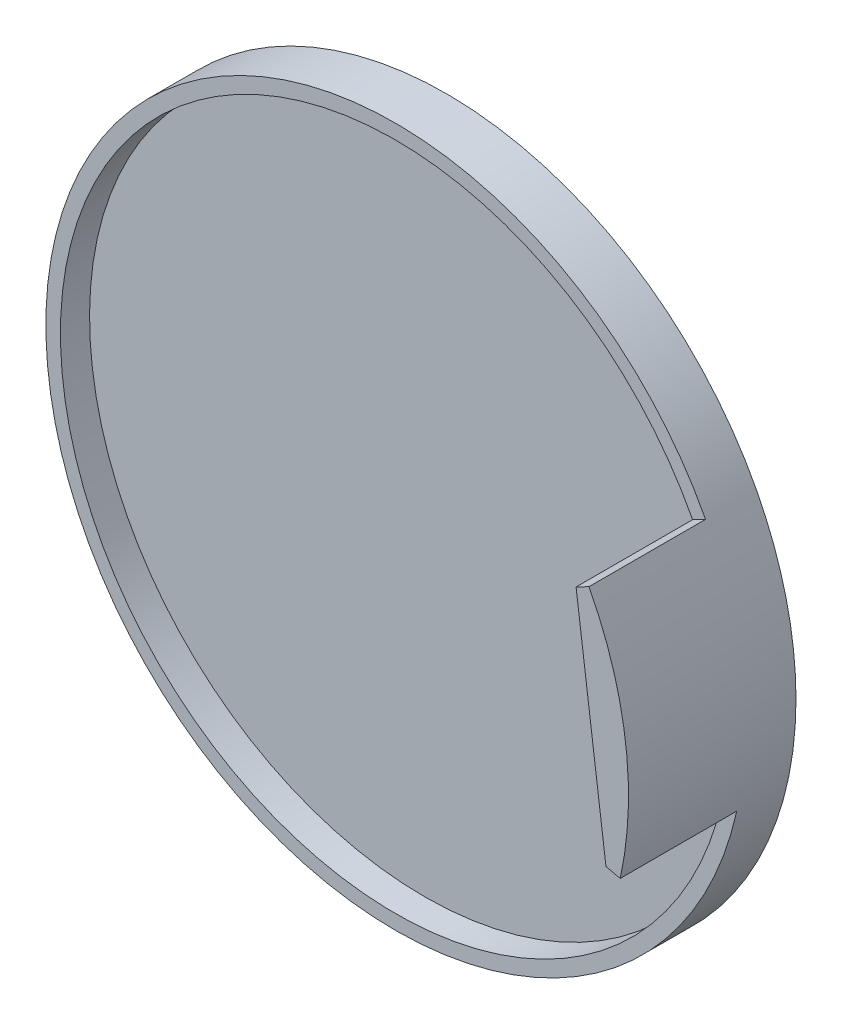
ISO-10303-21;
HEADER;
FILE_DESCRIPTION(('STEP AP214'),'2;1');
FILE_NAME('part.step','',(''),(''),'','','');
FILE_SCHEMA(('AUTOMOTIVE_DESIGN { 1 0 10303 214 1 1 1 1 }'));
ENDSEC;
DATA;
#1=APPLICATION_CONTEXT('core data for automotive mechanical design processes');
#2=APPLICATION_PROTOCOL_DEFINITION('international standard','automotive_design',2000,#1);
#3=PRODUCT_CONTEXT('',#1,'mechanical');
#4=PRODUCT('Part','Part','',(#3));
#5=PRODUCT_RELATED_PRODUCT_CATEGORY('part','',(#4));
#6=PRODUCT_DEFINITION_FORMATION('','',#4);
#7=PRODUCT_DEFINITION_CONTEXT('part definition',#1,'design');
#8=PRODUCT_DEFINITION('design','',#6,#7);
#9=PRODUCT_DEFINITION_SHAPE('','',#8);
#10=(LENGTH_UNIT() NAMED_UNIT(*) SI_UNIT(.MILLI.,.METRE.));
#11=(NAMED_UNIT(*) PLANE_ANGLE_UNIT() SI_UNIT($,.RADIAN.));
#12=(NAMED_UNIT(*) SI_UNIT($,.STERADIAN.) SOLID_ANGLE_UNIT());
#13=UNCERTAINTY_MEASURE_WITH_UNIT(LENGTH_MEASURE(1.E-05),#10,'distance_accuracy_value','');
#14=(GEOMETRIC_REPRESENTATION_CONTEXT(3) GLOBAL_UNCERTAINTY_ASSIGNED_CONTEXT((#13)) GLOBAL_UNIT_ASSIGNED_CONTEXT((#10,
#11,#12)) REPRESENTATION_CONTEXT('',''));
#15=CARTESIAN_POINT('',(0.,0.,0.));
#16=DIRECTION('',(0.,0.,1.));
#17=DIRECTION('',(1.,0.,0.));
#18=AXIS2_PLACEMENT_3D('',#15,#16,#17);
#19=CARTESIAN_POINT('',(0.,0.,7.));
#20=DIRECTION('',(0.,0.,-1.));
#21=DIRECTION('',(-1.,0.,0.));
#22=AXIS2_PLACEMENT_3D('',#19,#20,#21);
#23=CYLINDRICAL_SURFACE('',#22,46.);
#24=DIRECTION('',(0.,0.,-1.));
#25=VECTOR('',#24,1.);
#26=CARTESIAN_POINT('',(44.9094466857138,-9.95698741502827,23.));
#27=LINE('',#26,#25);
#28=CARTESIAN_POINT('',(44.9094466857138,-9.95698741502827,7.));
#29=VERTEX_POINT('',#28);
#30=CARTESIAN_POINT('',(44.9094466857138,-9.95698741502827,5.));
#31=VERTEX_POINT('',#30);
#32=EDGE_CURVE('E183',#29,#31,#27,.T.);
#33=ORIENTED_EDGE('',*,*,#32,.T.);
#34=CARTESIAN_POINT('',(44.9094466857138,-9.95698741502827,5.));
#35=CARTESIAN_POINT('',(44.9094484979789,-9.95697864692831,4.97780928253393));
#36=CARTESIAN_POINT('',(44.9092127821698,-9.95804244012008,4.95563284920664));
#37=CARTESIAN_POINT('',(44.9082839136339,-9.96223083377192,4.91151752731491));
#38=CARTESIAN_POINT('',(44.9075914448565,-9.96535235295462,4.88957833335246));
#39=CARTESIAN_POINT('',(44.9048803161431,-9.97756455506592,4.82495281706136));
#40=CARTESIAN_POINT('',(44.9022268189661,-9.98950816769606,4.78281366363518));
#41=CARTESIAN_POINT('',(44.8945945166685,-10.023759714534,4.69026648529544));
#42=CARTESIAN_POINT('',(44.8891862266514,-10.0479737860875,4.64062063157637));
#43=CARTESIAN_POINT('',(44.8766523344462,-10.1038059717788,4.54568446123888));
#44=CARTESIAN_POINT('',(44.8695167457107,-10.1354671105618,4.50042169801581));
#45=CARTESIAN_POINT('',(44.8549818486334,-10.1995856424106,4.41962320621741));
#46=CARTESIAN_POINT('',(44.8477269253892,-10.2314491107903,4.38357877206862));
#47=CARTESIAN_POINT('',(44.8324781398251,-10.2980618301886,4.3144111624617));
#48=CARTESIAN_POINT('',(44.8244836757903,-10.3328134287086,4.28129040939054));
#49=CARTESIAN_POINT('',(44.7996073232082,-10.4403334687153,4.18568906365564));
#50=CARTESIAN_POINT('',(44.7818467173626,-10.5163040066043,4.12704332280646));
#51=CARTESIAN_POINT('',(44.750174215354,-10.6501259841854,4.03372904736004));
#52=CARTESIAN_POINT('',(44.7366634332809,-10.7067479989577,3.99707630534939));
#53=CARTESIAN_POINT('',(44.708958221126,-10.8218554591795,3.92708812855779));
#54=CARTESIAN_POINT('',(44.6947637266389,-10.8803410800031,3.8937530072048));
#55=CARTESIAN_POINT('',(44.6512527090227,-11.0580511089374,3.79789294697645));
#56=CARTESIAN_POINT('',(44.6210500873476,-11.1793530735633,3.7396303059097));
#57=CARTESIAN_POINT('',(44.5584766585864,-11.4262217042077,3.63152161297643));
#58=CARTESIAN_POINT('',(44.5260905615109,-11.551814555104,3.58174594399659));
#59=CARTESIAN_POINT('',(44.4596011708921,-11.805125889143,3.48966512244806));
#60=CARTESIAN_POINT('',(44.4254992497149,-11.9328426204771,3.44735411776078));
#61=CARTESIAN_POINT('',(44.3590398022853,-12.1774412361614,3.37294291865779));
#62=CARTESIAN_POINT('',(44.3268294482847,-12.2941852284818,3.34025227252287));
#63=CARTESIAN_POINT('',(44.261153895656,-12.5285706027498,3.27969143826322));
#64=CARTESIAN_POINT('',(44.2276885444403,-12.6462120924246,3.25182183862776));
#65=CARTESIAN_POINT('',(44.1254200535658,-13.0002935163549,3.17492437186188));
#66=CARTESIAN_POINT('',(44.0547912108213,-13.2377181071108,3.13265897195898));
#67=CARTESIAN_POINT('',(43.9467793911827,-13.5902540192703,3.08264796054708));
#68=CARTESIAN_POINT('',(43.9111228396827,-13.7050281401387,3.06836107753589));
#69=CARTESIAN_POINT('',(43.8387839598204,-13.9346870660438,3.04376102284614));
#70=CARTESIAN_POINT('',(43.8021016459678,-14.0495718694927,3.0334477949899));
#71=CARTESIAN_POINT('',(43.7278156752705,-14.2790986568705,3.016860633479));
#72=CARTESIAN_POINT('',(43.6902138464554,-14.3937406971669,3.01057926999836));
#73=CARTESIAN_POINT('',(43.6140617853193,-14.6228658654969,3.0021540635979));
#74=CARTESIAN_POINT('',(43.5755115165049,-14.7373489872361,3.00001038013746));
#75=CARTESIAN_POINT('',(43.5365074746326,-14.8516839756057,3.));
#76=B_SPLINE_CURVE_WITH_KNOTS('',3,(#34,#35,#36,#37,#38,#39,#40,#41,#42,#43,#44,#45,#46,#47,#48,
#49,#50,#51,#52,#53,#54,#55,#56,#57,#58,#59,#60,#61,#62,#63,#64,#65,#66,#67,#68,#69,#70,#71,#72,
#73,#74,#75),.UNSPECIFIED.,.F.,.F.,(4,2,2,2,2,2,2,2,2,2,2,2,2,2,2,2,2,2,2,2,4),(0.,
0.0665196373917227,0.132939892612061,0.263876872774713,0.429458091545529,0.596020512648292,
0.741768604759595,0.887636343250726,1.17966372327486,1.38594680650768,1.59224935960764,
2.00549665484475,2.42201991692224,2.83821516943183,3.21442529150407,3.59068130395075,
4.34374904000551,4.706796162286,5.06983815178887,5.43220920058624,5.79459421428894),.UNSPECIFIED.);
#77=CARTESIAN_POINT('',(43.5365074746326,-14.8516839756056,3.));
#78=VERTEX_POINT('',#77);
#79=EDGE_CURVE('E49',#31,#78,#76,.T.);
#80=ORIENTED_EDGE('',*,*,#79,.T.);
#81=CARTESIAN_POINT('',(0.,0.,3.));
#82=DIRECTION('',(0.,0.,1.));
#83=DIRECTION('',(1.,0.,0.));
#84=AXIS2_PLACEMENT_3D('',#81,#82,#83);
#85=CIRCLE('',#84,46.);
#86=CARTESIAN_POINT('',(38.2100110878032,25.6124003691563,3.));
#87=VERTEX_POINT('',#86);
#88=EDGE_CURVE('E123',#87,#78,#85,.T.);
#89=ORIENTED_EDGE('',*,*,#88,.F.);
#90=CARTESIAN_POINT('',(38.2100110878032,25.6124003691563,3.));
#91=CARTESIAN_POINT('',(38.2918494461074,25.4903122948155,3.00002310780354));
#92=CARTESIAN_POINT('',(38.3730944682514,25.3678383832604,3.0031889620152));
#93=CARTESIAN_POINT('',(38.5342701791394,25.1223315807279,3.0156051697659));
#94=CARTESIAN_POINT('',(38.6142008511448,24.999298682657,3.02485560073207));
#95=CARTESIAN_POINT('',(38.7730176435535,24.7522682706982,3.04930145563668));
#96=CARTESIAN_POINT('',(38.8518964615552,24.628269021497,3.06452663106244));
#97=CARTESIAN_POINT('',(39.0080765874625,24.3801445093109,3.10088079737583));
#98=CARTESIAN_POINT('',(39.0853779248424,24.256019248726,3.12200967784802));
#99=CARTESIAN_POINT('',(39.2383421911076,24.0077856905078,3.1702869641491));
#100=CARTESIAN_POINT('',(39.3140037555792,23.8836774864011,3.19744018638945));
#101=CARTESIAN_POINT('',(39.4634764374127,23.635882848726,3.2580291135735));
#102=CARTESIAN_POINT('',(39.5372876700455,23.5121963893008,3.2914644260515));
#103=CARTESIAN_POINT('',(39.6827227885192,23.2658961651123,3.36505140725816));
#104=CARTESIAN_POINT('',(39.7543508749941,23.143280713106,3.40518906955898));
#105=CARTESIAN_POINT('',(39.8952863254682,22.8994743506077,3.49305273428296));
#106=CARTESIAN_POINT('',(39.9645947083265,22.7782828302882,3.54077535085952));
#107=CARTESIAN_POINT('',(40.0598263536699,22.6100285853889,3.61397981696218));
#108=CARTESIAN_POINT('',(40.0869096489136,22.5619741842593,3.63569645123543));
#109=CARTESIAN_POINT('',(40.1405839716075,22.4663420997402,3.68072154465258));
#110=CARTESIAN_POINT('',(40.1671750004941,22.4187644149599,3.70402999915101));
#111=CARTESIAN_POINT('',(40.2462865660254,22.2766282826306,3.77670002093697));
#112=CARTESIAN_POINT('',(40.2980006938768,22.1829228924906,3.82869682873566));
#113=CARTESIAN_POINT('',(40.376422348241,22.0396908073893,3.91666031806129));
#114=CARTESIAN_POINT('',(40.4041258346997,21.9888576807676,3.94962079457477));
#115=CARTESIAN_POINT('',(40.4584115227438,21.888813772077,4.01875525397806));
#116=CARTESIAN_POINT('',(40.4849941491728,21.8396023768909,4.0549280028637));
#117=CARTESIAN_POINT('',(40.5366518161158,21.7435696636194,4.13094971277459));
#118=CARTESIAN_POINT('',(40.5617317379491,21.6967406908528,4.17078557055637));
#119=CARTESIAN_POINT('',(40.6099827094,21.6062935411961,4.2549546320906));
#120=CARTESIAN_POINT('',(40.6331561838975,21.5626712933202,4.29928195757314));
#121=CARTESIAN_POINT('',(40.672915888595,21.4875634655945,4.38492669032514));
#122=CARTESIAN_POINT('',(40.6899376842072,21.4553052596559,4.42535472795517));
#123=CARTESIAN_POINT('',(40.7215129946694,21.3953154870884,4.51041610813143));
#124=CARTESIAN_POINT('',(40.7360670005339,21.3675830200175,4.55504861136234));
#125=CARTESIAN_POINT('',(40.7597564277679,21.3223546703153,4.64162235887325));
#126=CARTESIAN_POINT('',(40.7693791056328,21.3039437623176,4.68294271445228));
#127=CARTESIAN_POINT('',(40.7853253458884,21.2733997643965,4.76839240118566));
#128=CARTESIAN_POINT('',(40.7916601367516,21.2612453092302,4.81251158682342));
#129=CARTESIAN_POINT('',(40.7982548333299,21.2485864488017,4.88089072049322));
#130=CARTESIAN_POINT('',(40.7999711470436,21.2452904089018,4.90451483391833));
#131=CARTESIAN_POINT('',(40.8022781689476,21.2408591772133,4.95208566303319));
#132=CARTESIAN_POINT('',(40.8028656653832,21.239730151106,4.97603310456847));
#133=CARTESIAN_POINT('',(40.802860217324,21.2397410079671,5.));
#134=B_SPLINE_CURVE_WITH_KNOTS('',3,(#90,#91,#92,#93,#94,#95,#96,#97,#98,#99,#100,#101,#102,
#103,#104,#105,#106,#107,#108,#109,#110,#111,#112,#113,#114,#115,#116,#117,#118,#119,#120,#121,
#122,#123,#124,#125,#126,#127,#128,#129,#130,#131,#132,#133),.UNSPECIFIED.,.F.,.F.,(4,2,2,2,2,2,
2,2,2,2,2,2,2,2,2,2,2,2,2,2,2,4),(0.,0.440889720103397,0.881785050700306,1.32490427931822,
1.76801522094867,2.21148171095269,2.65492050515023,3.0974439491045,3.53977040703329,
3.71759332063344,3.89541571530903,4.25200104013369,4.45177428145495,4.65147110854605,
4.85047950220536,5.04923072500702,5.21228435583255,5.37530550581979,5.51356587379351,
5.65135090895101,5.72297948167741,5.79481155474189),.UNSPECIFIED.);
#135=CARTESIAN_POINT('',(40.802860217324,21.2397410079671,5.));
#136=VERTEX_POINT('',#135);
#137=EDGE_CURVE('E136',#87,#136,#134,.T.);
#138=ORIENTED_EDGE('',*,*,#137,.T.);
#139=DIRECTION('',(0.,0.,-1.));
#140=VECTOR('',#139,1.);
#141=CARTESIAN_POINT('',(40.802860217324,21.2397410079671,23.));
#142=LINE('',#141,#140);
#143=CARTESIAN_POINT('',(40.802860217324,21.2397410079671,7.));
#144=VERTEX_POINT('',#143);
#145=EDGE_CURVE('E179',#144,#136,#142,.T.);
#146=ORIENTED_EDGE('',*,*,#145,.F.);
#147=CARTESIAN_POINT('',(0.,0.,7.));
#148=DIRECTION('',(0.,0.,1.));
#149=DIRECTION('',(1.,0.,0.));
#150=AXIS2_PLACEMENT_3D('',#147,#148,#149);
#151=CIRCLE('',#150,46.);
#152=EDGE_CURVE('E127',#144,#29,#151,.T.);
#153=ORIENTED_EDGE('',*,*,#152,.T.);
#154=EDGE_LOOP('',(#33,#80,#89,#138,#146,#153));
#155=FACE_BOUND('',#154,.T.);
#156=ADVANCED_FACE('F41',(#155),#23,.F.);
#157=CARTESIAN_POINT('',(0.,0.,7.));
#158=DIRECTION('',(0.,0.,1.));
#159=DIRECTION('',(1.,0.,0.));
#160=AXIS2_PLACEMENT_3D('',#157,#158,#159);
#161=PLANE('',#160);
#162=CARTESIAN_POINT('',(0.,0.,7.));
#163=DIRECTION('',(0.,0.,1.));
#164=DIRECTION('',(1.,0.,0.));
#165=AXIS2_PLACEMENT_3D('',#162,#163,#164);
#166=CIRCLE('',#165,48.);
#167=CARTESIAN_POINT('',(42.5768976180772,22.1632080083135,7.));
#168=VERTEX_POINT('',#167);
#169=CARTESIAN_POINT('',(46.8620313242231,-10.3898999113338,7.));
#170=VERTEX_POINT('',#169);
#171=EDGE_CURVE('E126',#168,#170,#166,.T.);
#172=ORIENTED_EDGE('',*,*,#171,.T.);
#173=DIRECTION('',(-0.976292319254648,0.216456248152789,0.));
#174=VECTOR('',#173,1.);
#175=CARTESIAN_POINT('',(0.,0.,7.));
#176=LINE('',#175,#174);
#177=EDGE_CURVE('E114',#170,#29,#176,.T.);
#178=ORIENTED_EDGE('',*,*,#177,.T.);
#179=ORIENTED_EDGE('',*,*,#152,.F.);
#180=DIRECTION('',(0.887018700376609,0.461733500173198,0.));
#181=VECTOR('',#180,1.);
#182=CARTESIAN_POINT('',(0.,0.,7.));
#183=LINE('',#182,#181);
#184=EDGE_CURVE('E116',#144,#168,#183,.T.);
#185=ORIENTED_EDGE('',*,*,#184,.T.);
#186=EDGE_LOOP('',(#172,#178,#179,#185));
#187=FACE_BOUND('',#186,.T.);
#188=ADVANCED_FACE('F155',(#187),#161,.T.);
#189=CARTESIAN_POINT('',(0.,0.,3.));
#190=DIRECTION('',(0.,0.,-1.));
#191=DIRECTION('',(-1.,0.,0.));
#192=AXIS2_PLACEMENT_3D('',#189,#190,#191);
#193=CYLINDRICAL_SURFACE('',#192,48.);
#194=CARTESIAN_POINT('',(0.,0.,0.));
#195=DIRECTION('',(0.,0.,1.));
#196=DIRECTION('',(1.,0.,0.));
#197=AXIS2_PLACEMENT_3D('',#194,#195,#196);
#198=CIRCLE('',#197,48.);
#199=CARTESIAN_POINT('',(48.,0.,0.));
#200=VERTEX_POINT('',#199);
#201=EDGE_CURVE('E131',#200,#200,#198,.T.);
#202=ORIENTED_EDGE('',*,*,#201,.T.);
#203=EDGE_LOOP('',(#202));
#204=FACE_BOUND('',#203,.T.);
#205=ORIENTED_EDGE('',*,*,#171,.F.);
#206=DIRECTION('',(0.,0.,-1.));
#207=VECTOR('',#206,1.);
#208=CARTESIAN_POINT('',(42.5768976180772,22.1632080083135,23.));
#209=LINE('',#208,#207);
#210=CARTESIAN_POINT('',(42.5768976180772,22.1632080083135,23.));
#211=VERTEX_POINT('',#210);
#212=EDGE_CURVE('E100',#211,#168,#209,.T.);
#213=ORIENTED_EDGE('',*,*,#212,.F.);
#214=CARTESIAN_POINT('',(0.,0.,23.));
#215=DIRECTION('',(0.,0.,1.));
#216=DIRECTION('',(1.,0.,0.));
#217=AXIS2_PLACEMENT_3D('',#214,#215,#216);
#218=CIRCLE('',#217,48.);
#219=CARTESIAN_POINT('',(46.8620313242231,-10.3898999113338,23.));
#220=VERTEX_POINT('',#219);
#221=EDGE_CURVE('E95',#220,#211,#218,.T.);
#222=ORIENTED_EDGE('',*,*,#221,.F.);
#223=DIRECTION('',(0.,0.,-1.));
#224=VECTOR('',#223,1.);
#225=CARTESIAN_POINT('',(46.8620313242231,-10.3898999113338,23.));
#226=LINE('',#225,#224);
#227=EDGE_CURVE('E97',#220,#170,#226,.T.);
#228=ORIENTED_EDGE('',*,*,#227,.T.);
#229=EDGE_LOOP('',(#205,#213,#222,#228));
#230=FACE_BOUND('',#229,.T.);
#231=ADVANCED_FACE('F94',(#204,#230),#193,.T.);
#232=CARTESIAN_POINT('',(0.,0.,0.));
#233=DIRECTION('',(0.,0.,1.));
#234=DIRECTION('',(1.,0.,0.));
#235=AXIS2_PLACEMENT_3D('',#232,#233,#234);
#236=PLANE('',#235);
#237=ORIENTED_EDGE('',*,*,#201,.F.);
#238=EDGE_LOOP('',(#237));
#239=FACE_BOUND('',#238,.T.);
#240=ADVANCED_FACE('F156',(#239),#236,.F.);
#241=CARTESIAN_POINT('',(0.,0.,3.));
#242=DIRECTION('',(0.,0.,1.));
#243=DIRECTION('',(1.,0.,0.));
#244=AXIS2_PLACEMENT_3D('',#241,#242,#243);
#245=PLANE('',#244);
#246=ORIENTED_EDGE('',*,*,#88,.T.);
#247=DIRECTION('',(0.130509299847046,-0.991447085150506,0.));
#248=VECTOR('',#247,1.);
#249=CARTESIAN_POINT('',(40.8732592812179,5.38035819677533,3.));
#250=LINE('',#249,#248);
#251=EDGE_CURVE('E11',#78,#87,#250,.F.);
#252=ORIENTED_EDGE('',*,*,#251,.T.);
#253=EDGE_LOOP('',(#246,#252));
#254=FACE_BOUND('',#253,.T.);
#255=ADVANCED_FACE('F153',(#254),#245,.T.);
#256=CARTESIAN_POINT('',(0.,0.,23.));
#257=DIRECTION('',(0.216456248152789,0.976292319254648,0.));
#258=DIRECTION('',(-0.976292319254648,0.216456248152789,0.));
#259=AXIS2_PLACEMENT_3D('',#256,#257,#258);
#260=PLANE('',#259);
#261=ORIENTED_EDGE('',*,*,#177,.F.);
#262=ORIENTED_EDGE('',*,*,#227,.F.);
#263=DIRECTION('',(0.976292319254647,-0.216456248152789,0.));
#264=VECTOR('',#263,1.);
#265=CARTESIAN_POINT('',(0.,0.,23.));
#266=LINE('',#265,#264);
#267=CARTESIAN_POINT('',(44.9094466857138,-9.95698741502827,23.));
#268=VERTEX_POINT('',#267);
#269=EDGE_CURVE('E101',#268,#220,#266,.T.);
#270=ORIENTED_EDGE('',*,*,#269,.F.);
#271=EDGE_CURVE('E182',#268,#29,#27,.T.);
#272=ORIENTED_EDGE('',*,*,#271,.T.);
#273=EDGE_LOOP('',(#261,#262,#270,#272));
#274=FACE_BOUND('',#273,.T.);
#275=ADVANCED_FACE('F113',(#274),#260,.F.);
#276=CARTESIAN_POINT('',(0.,0.,23.));
#277=DIRECTION('',(0.461733500173198,-0.887018700376609,0.));
#278=DIRECTION('',(0.887018700376609,0.461733500173198,0.));
#279=AXIS2_PLACEMENT_3D('',#276,#277,#278);
#280=PLANE('',#279);
#281=ORIENTED_EDGE('',*,*,#184,.F.);
#282=CARTESIAN_POINT('',(40.802860217324,21.2397410079671,23.));
#283=VERTEX_POINT('',#282);
#284=EDGE_CURVE('E119',#283,#144,#142,.T.);
#285=ORIENTED_EDGE('',*,*,#284,.F.);
#286=DIRECTION('',(-0.887018700376609,-0.461733500173198,0.));
#287=VECTOR('',#286,1.);
#288=CARTESIAN_POINT('',(0.,0.,23.));
#289=LINE('',#288,#287);
#290=EDGE_CURVE('E105',#211,#283,#289,.T.);
#291=ORIENTED_EDGE('',*,*,#290,.F.);
#292=ORIENTED_EDGE('',*,*,#212,.T.);
#293=EDGE_LOOP('',(#281,#285,#291,#292));
#294=FACE_BOUND('',#293,.T.);
#295=ADVANCED_FACE('F174',(#294),#280,.F.);
#296=CARTESIAN_POINT('',(42.8561534515189,5.64137679646942,23.));
#297=DIRECTION('',(0.991447085150506,0.130509299847046,0.));
#298=DIRECTION('',(-0.130509299847046,0.991447085150506,0.));
#299=AXIS2_PLACEMENT_3D('',#296,#297,#298);
#300=PLANE('',#299);
#301=ORIENTED_EDGE('',*,*,#145,.T.);
#302=DIRECTION('',(0.130509299847046,-0.991447085150506,0.));
#303=VECTOR('',#302,1.);
#304=CARTESIAN_POINT('',(42.8561534515189,5.64137679646942,5.));
#305=LINE('',#304,#303);
#306=EDGE_CURVE('E134',#136,#31,#305,.T.);
#307=ORIENTED_EDGE('',*,*,#306,.T.);
#308=ORIENTED_EDGE('',*,*,#32,.F.);
#309=ORIENTED_EDGE('',*,*,#271,.F.);
#310=DIRECTION('',(0.130509299847046,-0.991447085150506,0.));
#311=VECTOR('',#310,1.);
#312=CARTESIAN_POINT('',(42.8561534515189,5.64137679646942,23.));
#313=LINE('',#312,#311);
#314=EDGE_CURVE('E108',#283,#268,#313,.T.);
#315=ORIENTED_EDGE('',*,*,#314,.F.);
#316=ORIENTED_EDGE('',*,*,#284,.T.);
#317=EDGE_LOOP('',(#301,#307,#308,#309,#315,#316));
#318=FACE_BOUND('',#317,.T.);
#319=ADVANCED_FACE('F177',(#318),#300,.F.);
#320=CARTESIAN_POINT('',(0.,0.,23.));
#321=DIRECTION('',(0.,0.,1.));
#322=DIRECTION('',(1.,0.,0.));
#323=AXIS2_PLACEMENT_3D('',#320,#321,#322);
#324=PLANE('',#323);
#325=ORIENTED_EDGE('',*,*,#269,.T.);
#326=ORIENTED_EDGE('',*,*,#221,.T.);
#327=ORIENTED_EDGE('',*,*,#290,.T.);
#328=ORIENTED_EDGE('',*,*,#314,.T.);
#329=EDGE_LOOP('',(#325,#326,#327,#328));
#330=FACE_BOUND('',#329,.T.);
#331=ADVANCED_FACE('F106',(#330),#324,.T.);
#332=CARTESIAN_POINT('',(40.8732592812179,5.38035819677533,5.));
#333=DIRECTION('',(0.130509299847046,-0.991447085150506,0.));
#334=DIRECTION('',(0.991447085150506,0.130509299847046,0.));
#335=AXIS2_PLACEMENT_3D('',#332,#333,#334);
#336=CYLINDRICAL_SURFACE('',#335,2.);
#337=ORIENTED_EDGE('',*,*,#137,.F.);
#338=ORIENTED_EDGE('',*,*,#251,.F.);
#339=ORIENTED_EDGE('',*,*,#79,.F.);
#340=ORIENTED_EDGE('',*,*,#306,.F.);
#341=EDGE_LOOP('',(#337,#338,#339,#340));
#342=FACE_BOUND('',#341,.T.);
#343=ADVANCED_FACE('F43',(#342),#336,.F.);
#344=CLOSED_SHELL('',(#156,#188,#231,#240,#255,#275,#295,#319,#331,#343));
#345=MANIFOLD_SOLID_BREP('B2',#344);
#346=ADVANCED_BREP_SHAPE_REPRESENTATION('',(#18,#345),#14);
#347=SHAPE_DEFINITION_REPRESENTATION(#9,#346);
ENDSEC;
END-ISO-10303-21;
